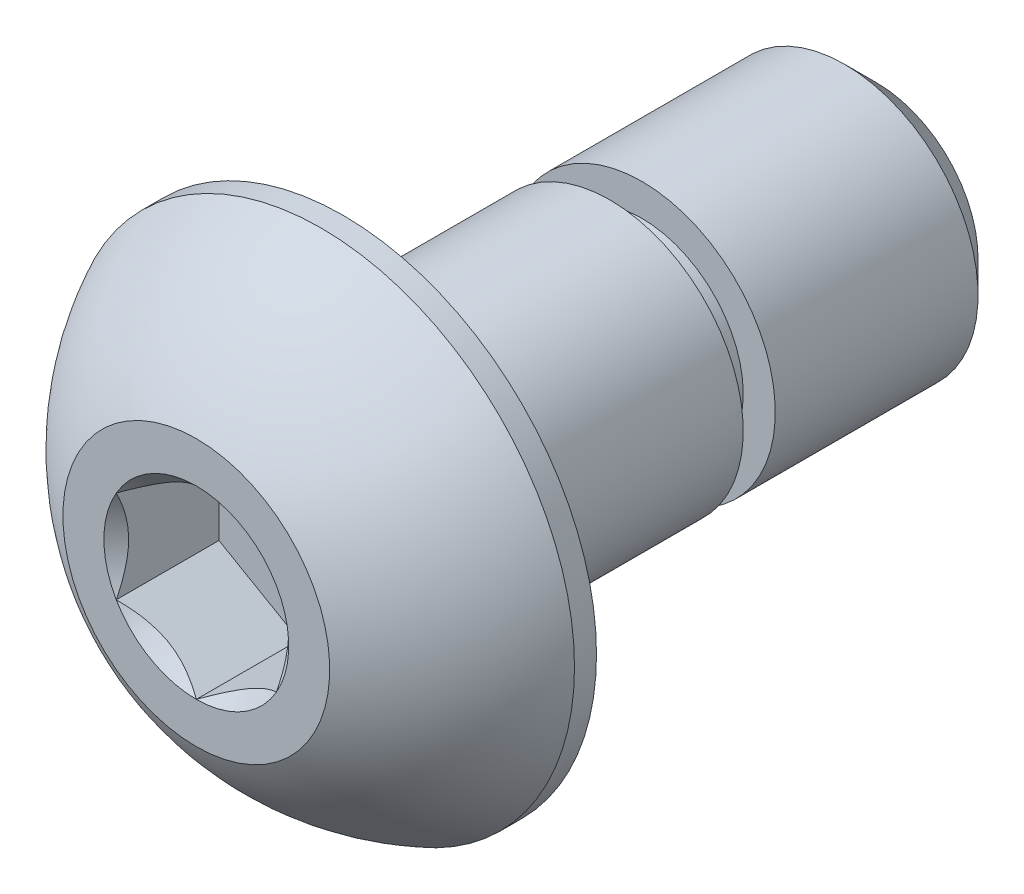
ISO-10303-21;
HEADER;
FILE_DESCRIPTION(('STEP AP214'),'2;1');
FILE_NAME('part.step','',(''),(''),'','','');
FILE_SCHEMA(('AUTOMOTIVE_DESIGN { 1 0 10303 214 1 1 1 1 }'));
ENDSEC;
DATA;
#1=APPLICATION_CONTEXT('core data for automotive mechanical design processes');
#2=APPLICATION_PROTOCOL_DEFINITION('international standard','automotive_design',2000,#1);
#3=PRODUCT_CONTEXT('',#1,'mechanical');
#4=PRODUCT('Part','Part','',(#3));
#5=PRODUCT_RELATED_PRODUCT_CATEGORY('part','',(#4));
#6=PRODUCT_DEFINITION_FORMATION('','',#4);
#7=PRODUCT_DEFINITION_CONTEXT('part definition',#1,'design');
#8=PRODUCT_DEFINITION('design','',#6,#7);
#9=PRODUCT_DEFINITION_SHAPE('','',#8);
#10=(LENGTH_UNIT() NAMED_UNIT(*) SI_UNIT(.MILLI.,.METRE.));
#11=(NAMED_UNIT(*) PLANE_ANGLE_UNIT() SI_UNIT($,.RADIAN.));
#12=(NAMED_UNIT(*) SI_UNIT($,.STERADIAN.) SOLID_ANGLE_UNIT());
#13=UNCERTAINTY_MEASURE_WITH_UNIT(LENGTH_MEASURE(1.E-05),#10,'distance_accuracy_value','');
#14=(GEOMETRIC_REPRESENTATION_CONTEXT(3) GLOBAL_UNCERTAINTY_ASSIGNED_CONTEXT((#13)) GLOBAL_UNIT_ASSIGNED_CONTEXT((#10,
#11,#12)) REPRESENTATION_CONTEXT('',''));
#15=CARTESIAN_POINT('',(0.,0.,0.));
#16=DIRECTION('',(0.,0.,1.));
#17=DIRECTION('',(1.,0.,0.));
#18=AXIS2_PLACEMENT_3D('',#15,#16,#17);
#19=CARTESIAN_POINT('',(0.,-1.73205080756888,-1.925));
#20=DIRECTION('',(0.5,-0.866025403784439,0.));
#21=DIRECTION('',(0.,0.,-1.));
#22=AXIS2_PLACEMENT_3D('',#19,#20,#21);
#23=PLANE('',#22);
#24=DIRECTION('',(0.,0.,1.));
#25=VECTOR('',#24,1.);
#26=CARTESIAN_POINT('',(0.,-1.73205080756888,-1.925));
#27=LINE('',#26,#25);
#28=CARTESIAN_POINT('',(0.,-1.73205080756888,-1.925));
#29=VERTEX_POINT('',#28);
#30=CARTESIAN_POINT('',(0.,-1.73205080756888,0.));
#31=VERTEX_POINT('',#30);
#32=EDGE_CURVE('E11',#29,#31,#27,.T.);
#33=ORIENTED_EDGE('',*,*,#32,.T.);
#34=CARTESIAN_POINT('',(0.,-1.73205080756888,0.));
#35=CARTESIAN_POINT('',(0.750000000000001,-1.29903810567666,-0.433012701892217));
#36=CARTESIAN_POINT('',(1.5,-0.866025403784438,0.));
#37=(BOUNDED_CURVE() B_SPLINE_CURVE(2,(#34,#35,#36),.UNSPECIFIED.,.F.,
.F.) B_SPLINE_CURVE_WITH_KNOTS((3,3),(-0.388312804292311,-0.130611113351457),
.UNSPECIFIED.) CURVE() GEOMETRIC_REPRESENTATION_ITEM() RATIONAL_B_SPLINE_CURVE((1.3094010767585,
1.51196612828742,1.3094010767585)) REPRESENTATION_ITEM(''));
#38=CARTESIAN_POINT('',(1.5,-0.866025403784439,0.));
#39=VERTEX_POINT('',#38);
#40=EDGE_CURVE('E142',#31,#39,#37,.T.);
#41=ORIENTED_EDGE('',*,*,#40,.T.);
#42=DIRECTION('',(0.,0.,1.));
#43=VECTOR('',#42,1.);
#44=CARTESIAN_POINT('',(1.5,-0.866025403784438,-1.925));
#45=LINE('',#44,#43);
#46=CARTESIAN_POINT('',(1.5,-0.866025403784438,-1.925));
#47=VERTEX_POINT('',#46);
#48=EDGE_CURVE('E127',#47,#39,#45,.T.);
#49=ORIENTED_EDGE('',*,*,#48,.F.);
#50=DIRECTION('',(0.866025403784439,0.5,0.));
#51=VECTOR('',#50,1.);
#52=CARTESIAN_POINT('',(0.,-1.73205080756888,-1.925));
#53=LINE('',#52,#51);
#54=EDGE_CURVE('E147',#29,#47,#53,.T.);
#55=ORIENTED_EDGE('',*,*,#54,.F.);
#56=EDGE_LOOP('',(#33,#41,#49,#55));
#57=FACE_BOUND('',#56,.T.);
#58=ADVANCED_FACE('F16',(#57),#23,.F.);
#59=CARTESIAN_POINT('',(-1.5,-0.866025403784439,-1.925));
#60=DIRECTION('',(-0.5,-0.866025403784439,0.));
#61=DIRECTION('',(-0.866025403784439,0.5,0.));
#62=AXIS2_PLACEMENT_3D('',#59,#60,#61);
#63=PLANE('',#62);
#64=DIRECTION('',(0.,0.,1.));
#65=VECTOR('',#64,1.);
#66=CARTESIAN_POINT('',(-1.5,-0.866025403784439,-1.925));
#67=LINE('',#66,#65);
#68=CARTESIAN_POINT('',(-1.5,-0.866025403784439,-1.925));
#69=VERTEX_POINT('',#68);
#70=CARTESIAN_POINT('',(-1.5,-0.86602540378444,0.));
#71=VERTEX_POINT('',#70);
#72=EDGE_CURVE('E25',#69,#71,#67,.T.);
#73=ORIENTED_EDGE('',*,*,#72,.T.);
#74=CARTESIAN_POINT('',(-1.5,-0.86602540378444,0.));
#75=CARTESIAN_POINT('',(-0.749999999999999,-1.29903810567666,-0.433012701892219));
#76=CARTESIAN_POINT('',(0.,-1.73205080756888,0.));
#77=(BOUNDED_CURVE() B_SPLINE_CURVE(2,(#74,#75,#76),.UNSPECIFIED.,.F.,
.F.) B_SPLINE_CURVE_WITH_KNOTS((3,3),(-0.388312804292311,-0.130611113351457),
.UNSPECIFIED.) CURVE() GEOMETRIC_REPRESENTATION_ITEM() RATIONAL_B_SPLINE_CURVE((1.3094010767585,
1.51196612828742,1.3094010767585)) REPRESENTATION_ITEM(''));
#78=EDGE_CURVE('E148',#71,#31,#77,.T.);
#79=ORIENTED_EDGE('',*,*,#78,.T.);
#80=ORIENTED_EDGE('',*,*,#32,.F.);
#81=DIRECTION('',(0.866025403784439,-0.5,0.));
#82=VECTOR('',#81,1.);
#83=CARTESIAN_POINT('',(-1.5,-0.866025403784439,-1.925));
#84=LINE('',#83,#82);
#85=EDGE_CURVE('E139',#69,#29,#84,.T.);
#86=ORIENTED_EDGE('',*,*,#85,.F.);
#87=EDGE_LOOP('',(#73,#79,#80,#86));
#88=FACE_BOUND('',#87,.T.);
#89=ADVANCED_FACE('F18',(#88),#63,.F.);
#90=CARTESIAN_POINT('',(-1.5,0.866025403784438,-1.925));
#91=DIRECTION('',(-1.,0.,0.));
#92=DIRECTION('',(0.,0.,1.));
#93=AXIS2_PLACEMENT_3D('',#90,#91,#92);
#94=PLANE('',#93);
#95=DIRECTION('',(0.,0.,1.));
#96=VECTOR('',#95,1.);
#97=CARTESIAN_POINT('',(-1.5,0.866025403784438,-1.925));
#98=LINE('',#97,#96);
#99=CARTESIAN_POINT('',(-1.5,0.866025403784438,-1.925));
#100=VERTEX_POINT('',#99);
#101=CARTESIAN_POINT('',(-1.5,0.866025403784438,0.));
#102=VERTEX_POINT('',#101);
#103=EDGE_CURVE('E46',#100,#102,#98,.T.);
#104=ORIENTED_EDGE('',*,*,#103,.T.);
#105=CARTESIAN_POINT('',(-1.5,0.866025403784436,0.));
#106=CARTESIAN_POINT('',(-1.5,0.,-0.433012701892219));
#107=CARTESIAN_POINT('',(-1.5,-0.86602540378444,0.));
#108=(BOUNDED_CURVE() B_SPLINE_CURVE(2,(#105,#106,#107),.UNSPECIFIED.,.F.,
.F.) B_SPLINE_CURVE_WITH_KNOTS((3,3),(-0.388312804292311,-0.130611113351457),
.UNSPECIFIED.) CURVE() GEOMETRIC_REPRESENTATION_ITEM() RATIONAL_B_SPLINE_CURVE((1.30940107675851,
1.51196612828742,1.3094010767585)) REPRESENTATION_ITEM(''));
#109=EDGE_CURVE('E229',#102,#71,#108,.T.);
#110=ORIENTED_EDGE('',*,*,#109,.T.);
#111=ORIENTED_EDGE('',*,*,#72,.F.);
#112=DIRECTION('',(0.,-1.,0.));
#113=VECTOR('',#112,1.);
#114=CARTESIAN_POINT('',(-1.5,0.866025403784438,-1.925));
#115=LINE('',#114,#113);
#116=EDGE_CURVE('E262',#100,#69,#115,.T.);
#117=ORIENTED_EDGE('',*,*,#116,.F.);
#118=EDGE_LOOP('',(#104,#110,#111,#117));
#119=FACE_BOUND('',#118,.T.);
#120=ADVANCED_FACE('F277',(#119),#94,.F.);
#121=CARTESIAN_POINT('',(0.,1.73205080756888,-1.925));
#122=DIRECTION('',(-0.5,0.866025403784439,0.));
#123=DIRECTION('',(0.,0.,1.));
#124=AXIS2_PLACEMENT_3D('',#121,#122,#123);
#125=PLANE('',#124);
#126=DIRECTION('',(0.,0.,1.));
#127=VECTOR('',#126,1.);
#128=CARTESIAN_POINT('',(0.,1.73205080756888,-1.925));
#129=LINE('',#128,#127);
#130=CARTESIAN_POINT('',(0.,1.73205080756888,-1.925));
#131=VERTEX_POINT('',#130);
#132=CARTESIAN_POINT('',(0.,1.73205080756888,0.));
#133=VERTEX_POINT('',#132);
#134=EDGE_CURVE('E188',#131,#133,#129,.T.);
#135=ORIENTED_EDGE('',*,*,#134,.T.);
#136=CARTESIAN_POINT('',(0.,1.73205080756888,0.));
#137=CARTESIAN_POINT('',(-0.749999999999999,1.29903810567666,-0.433012701892218));
#138=CARTESIAN_POINT('',(-1.5,0.866025403784438,0.));
#139=(BOUNDED_CURVE() B_SPLINE_CURVE(2,(#136,#137,#138),.UNSPECIFIED.,.F.,
.F.) B_SPLINE_CURVE_WITH_KNOTS((3,3),(-0.388312804292311,-0.130611113351457),
.UNSPECIFIED.) CURVE() GEOMETRIC_REPRESENTATION_ITEM() RATIONAL_B_SPLINE_CURVE((1.3094010767585,
1.51196612828742,1.3094010767585)) REPRESENTATION_ITEM(''));
#140=EDGE_CURVE('E221',#133,#102,#139,.T.);
#141=ORIENTED_EDGE('',*,*,#140,.T.);
#142=ORIENTED_EDGE('',*,*,#103,.F.);
#143=DIRECTION('',(-0.866025403784439,-0.5,0.));
#144=VECTOR('',#143,1.);
#145=CARTESIAN_POINT('',(0.,1.73205080756888,-1.925));
#146=LINE('',#145,#144);
#147=EDGE_CURVE('E258',#131,#100,#146,.T.);
#148=ORIENTED_EDGE('',*,*,#147,.F.);
#149=EDGE_LOOP('',(#135,#141,#142,#148));
#150=FACE_BOUND('',#149,.T.);
#151=ADVANCED_FACE('F306',(#150),#125,.F.);
#152=CARTESIAN_POINT('',(1.5,0.866025403784439,-1.925));
#153=DIRECTION('',(0.5,0.866025403784439,0.));
#154=DIRECTION('',(0.,0.,-1.));
#155=AXIS2_PLACEMENT_3D('',#152,#153,#154);
#156=PLANE('',#155);
#157=DIRECTION('',(0.,0.,1.));
#158=VECTOR('',#157,1.);
#159=CARTESIAN_POINT('',(1.5,0.866025403784439,-1.925));
#160=LINE('',#159,#158);
#161=CARTESIAN_POINT('',(1.5,0.866025403784439,-1.925));
#162=VERTEX_POINT('',#161);
#163=CARTESIAN_POINT('',(1.5,0.866025403784439,0.));
#164=VERTEX_POINT('',#163);
#165=EDGE_CURVE('E138',#162,#164,#160,.T.);
#166=ORIENTED_EDGE('',*,*,#165,.T.);
#167=CARTESIAN_POINT('',(1.5,0.86602540378444,0.));
#168=CARTESIAN_POINT('',(0.749999999999999,1.29903810567666,-0.433012701892218));
#169=CARTESIAN_POINT('',(0.,1.73205080756888,0.));
#170=(BOUNDED_CURVE() B_SPLINE_CURVE(2,(#167,#168,#169),.UNSPECIFIED.,.F.,
.F.) B_SPLINE_CURVE_WITH_KNOTS((3,3),(-0.388312804292311,-0.130611113351457),
.UNSPECIFIED.) CURVE() GEOMETRIC_REPRESENTATION_ITEM() RATIONAL_B_SPLINE_CURVE((1.3094010767585,
1.51196612828742,1.3094010767585)) REPRESENTATION_ITEM(''));
#171=EDGE_CURVE('E215',#164,#133,#170,.T.);
#172=ORIENTED_EDGE('',*,*,#171,.T.);
#173=ORIENTED_EDGE('',*,*,#134,.F.);
#174=DIRECTION('',(-0.866025403784439,0.5,0.));
#175=VECTOR('',#174,1.);
#176=CARTESIAN_POINT('',(1.5,0.866025403784439,-1.925));
#177=LINE('',#176,#175);
#178=EDGE_CURVE('E254',#162,#131,#177,.T.);
#179=ORIENTED_EDGE('',*,*,#178,.F.);
#180=EDGE_LOOP('',(#166,#172,#173,#179));
#181=FACE_BOUND('',#180,.T.);
#182=ADVANCED_FACE('F303',(#181),#156,.F.);
#183=CARTESIAN_POINT('',(1.5,-0.866025403784438,-1.925));
#184=DIRECTION('',(1.,0.,0.));
#185=DIRECTION('',(0.,1.,0.));
#186=AXIS2_PLACEMENT_3D('',#183,#184,#185);
#187=PLANE('',#186);
#188=ORIENTED_EDGE('',*,*,#48,.T.);
#189=CARTESIAN_POINT('',(1.5,-0.866025403784441,0.));
#190=CARTESIAN_POINT('',(1.5,0.,-0.433012701892218));
#191=CARTESIAN_POINT('',(1.5,0.866025403784438,0.));
#192=(BOUNDED_CURVE() B_SPLINE_CURVE(2,(#189,#190,#191),.UNSPECIFIED.,.F.,
.F.) B_SPLINE_CURVE_WITH_KNOTS((3,3),(-0.388312804292311,-0.130611113351457),
.UNSPECIFIED.) CURVE() GEOMETRIC_REPRESENTATION_ITEM() RATIONAL_B_SPLINE_CURVE((1.3094010767585,
1.51196612828742,1.3094010767585)) REPRESENTATION_ITEM(''));
#193=EDGE_CURVE('E131',#39,#164,#192,.T.);
#194=ORIENTED_EDGE('',*,*,#193,.T.);
#195=ORIENTED_EDGE('',*,*,#165,.F.);
#196=DIRECTION('',(0.,1.,0.));
#197=VECTOR('',#196,1.);
#198=CARTESIAN_POINT('',(1.5,-0.866025403784438,-1.925));
#199=LINE('',#198,#197);
#200=EDGE_CURVE('E133',#47,#162,#199,.T.);
#201=ORIENTED_EDGE('',*,*,#200,.F.);
#202=EDGE_LOOP('',(#188,#194,#195,#201));
#203=FACE_BOUND('',#202,.T.);
#204=ADVANCED_FACE('F129',(#203),#187,.F.);
#205=CARTESIAN_POINT('',(1.5,-0.866025403784438,-1.925));
#206=DIRECTION('',(0.,0.,1.));
#207=DIRECTION('',(1.,0.,0.));
#208=AXIS2_PLACEMENT_3D('',#205,#206,#207);
#209=PLANE('',#208);
#210=ORIENTED_EDGE('',*,*,#54,.T.);
#211=ORIENTED_EDGE('',*,*,#200,.T.);
#212=ORIENTED_EDGE('',*,*,#178,.T.);
#213=ORIENTED_EDGE('',*,*,#147,.T.);
#214=ORIENTED_EDGE('',*,*,#116,.T.);
#215=ORIENTED_EDGE('',*,*,#85,.T.);
#216=EDGE_LOOP('',(#210,#211,#212,#213,#214,#215));
#217=FACE_BOUND('',#216,.T.);
#218=ADVANCED_FACE('F388',(#217),#209,.T.);
#219=CARTESIAN_POINT('',(0.,0.,0.));
#220=DIRECTION('',(0.,0.,1.));
#221=DIRECTION('',(1.,0.,0.));
#222=AXIS2_PLACEMENT_3D('',#219,#220,#221);
#223=CONICAL_SURFACE('',#222,1.73205080756888,0.78539816339745);
#224=CARTESIAN_POINT('',(0.,0.,0.));
#225=DIRECTION('',(0.,0.,1.));
#226=DIRECTION('',(1.,0.,0.));
#227=AXIS2_PLACEMENT_3D('',#224,#225,#226);
#228=CIRCLE('',#227,1.73205080756888);
#229=EDGE_CURVE('E151',#31,#39,#228,.T.);
#230=ORIENTED_EDGE('',*,*,#229,.T.);
#231=ORIENTED_EDGE('',*,*,#40,.F.);
#232=EDGE_LOOP('',(#230,#231));
#233=FACE_BOUND('',#232,.T.);
#234=ADVANCED_FACE('F153',(#233),#223,.F.);
#235=CARTESIAN_POINT('',(0.,0.,0.));
#236=DIRECTION('',(0.,0.,1.));
#237=DIRECTION('',(1.,0.,0.));
#238=AXIS2_PLACEMENT_3D('',#235,#236,#237);
#239=CONICAL_SURFACE('',#238,1.73205080756888,0.78539816339745);
#240=CARTESIAN_POINT('',(0.,0.,0.));
#241=DIRECTION('',(0.,0.,1.));
#242=DIRECTION('',(1.,0.,0.));
#243=AXIS2_PLACEMENT_3D('',#240,#241,#242);
#244=CIRCLE('',#243,1.73205080756888);
#245=EDGE_CURVE('E157',#71,#31,#244,.T.);
#246=ORIENTED_EDGE('',*,*,#245,.T.);
#247=ORIENTED_EDGE('',*,*,#78,.F.);
#248=EDGE_LOOP('',(#246,#247));
#249=FACE_BOUND('',#248,.T.);
#250=ADVANCED_FACE('F275',(#249),#239,.F.);
#251=CARTESIAN_POINT('',(0.,0.,0.));
#252=DIRECTION('',(0.,0.,1.));
#253=DIRECTION('',(-1.,0.,0.));
#254=AXIS2_PLACEMENT_3D('',#251,#252,#253);
#255=CONICAL_SURFACE('',#254,1.73205080756888,0.78539816339745);
#256=CARTESIAN_POINT('',(0.,0.,0.));
#257=DIRECTION('',(0.,0.,1.));
#258=DIRECTION('',(1.,0.,0.));
#259=AXIS2_PLACEMENT_3D('',#256,#257,#258);
#260=CIRCLE('',#259,1.73205080756888);
#261=EDGE_CURVE('E198',#102,#71,#260,.T.);
#262=ORIENTED_EDGE('',*,*,#261,.T.);
#263=ORIENTED_EDGE('',*,*,#109,.F.);
#264=EDGE_LOOP('',(#262,#263));
#265=FACE_BOUND('',#264,.T.);
#266=ADVANCED_FACE('F279',(#265),#255,.F.);
#267=CARTESIAN_POINT('',(0.,0.,0.));
#268=DIRECTION('',(0.,0.,1.));
#269=DIRECTION('',(1.,0.,0.));
#270=AXIS2_PLACEMENT_3D('',#267,#268,#269);
#271=CONICAL_SURFACE('',#270,1.73205080756888,0.78539816339745);
#272=CARTESIAN_POINT('',(0.,0.,0.));
#273=DIRECTION('',(0.,0.,1.));
#274=DIRECTION('',(1.,0.,0.));
#275=AXIS2_PLACEMENT_3D('',#272,#273,#274);
#276=CIRCLE('',#275,1.73205080756888);
#277=EDGE_CURVE('E202',#133,#102,#276,.T.);
#278=ORIENTED_EDGE('',*,*,#277,.T.);
#279=ORIENTED_EDGE('',*,*,#140,.F.);
#280=EDGE_LOOP('',(#278,#279));
#281=FACE_BOUND('',#280,.T.);
#282=ADVANCED_FACE('F281',(#281),#271,.F.);
#283=CARTESIAN_POINT('',(0.,0.,0.));
#284=DIRECTION('',(0.,0.,1.));
#285=DIRECTION('',(1.,0.,0.));
#286=AXIS2_PLACEMENT_3D('',#283,#284,#285);
#287=CONICAL_SURFACE('',#286,1.73205080756888,0.78539816339745);
#288=CARTESIAN_POINT('',(0.,0.,0.));
#289=DIRECTION('',(0.,0.,1.));
#290=DIRECTION('',(1.,0.,0.));
#291=AXIS2_PLACEMENT_3D('',#288,#289,#290);
#292=CIRCLE('',#291,1.73205080756888);
#293=EDGE_CURVE('E158',#164,#133,#292,.T.);
#294=ORIENTED_EDGE('',*,*,#293,.T.);
#295=ORIENTED_EDGE('',*,*,#171,.F.);
#296=EDGE_LOOP('',(#294,#295));
#297=FACE_BOUND('',#296,.T.);
#298=ADVANCED_FACE('F288',(#297),#287,.F.);
#299=CARTESIAN_POINT('',(0.,-4.75,-2.75));
#300=DIRECTION('',(0.,0.,1.));
#301=DIRECTION('',(1.,0.,0.));
#302=AXIS2_PLACEMENT_3D('',#299,#300,#301);
#303=PLANE('',#302);
#304=CARTESIAN_POINT('',(0.,0.,-2.75));
#305=DIRECTION('',(0.,0.,-1.));
#306=DIRECTION('',(0.,-1.,0.));
#307=AXIS2_PLACEMENT_3D('',#304,#305,#306);
#308=CIRCLE('',#307,2.5);
#309=CARTESIAN_POINT('',(0.,2.5,-2.75));
#310=VERTEX_POINT('',#309);
#311=EDGE_CURVE('E179',#310,#310,#308,.T.);
#312=ORIENTED_EDGE('',*,*,#311,.F.);
#313=EDGE_LOOP('',(#312));
#314=FACE_BOUND('',#313,.T.);
#315=CARTESIAN_POINT('',(0.,0.,-2.75));
#316=DIRECTION('',(0.,0.,1.));
#317=DIRECTION('',(1.,0.,0.));
#318=AXIS2_PLACEMENT_3D('',#315,#316,#317);
#319=CIRCLE('',#318,4.75);
#320=CARTESIAN_POINT('',(-4.75,0.,-2.75));
#321=VERTEX_POINT('',#320);
#322=EDGE_CURVE('E194',#321,#321,#319,.T.);
#323=ORIENTED_EDGE('',*,*,#322,.F.);
#324=EDGE_LOOP('',(#323));
#325=FACE_BOUND('',#324,.T.);
#326=ADVANCED_FACE('F381',(#314,#325),#303,.F.);
#327=CARTESIAN_POINT('',(0.,-2.5,0.));
#328=DIRECTION('',(0.,0.,-1.));
#329=DIRECTION('',(0.,-1.,0.));
#330=AXIS2_PLACEMENT_3D('',#327,#328,#329);
#331=PLANE('',#330);
#332=ORIENTED_EDGE('',*,*,#261,.F.);
#333=ORIENTED_EDGE('',*,*,#277,.F.);
#334=ORIENTED_EDGE('',*,*,#293,.F.);
#335=CARTESIAN_POINT('',(0.,0.,0.));
#336=DIRECTION('',(0.,0.,1.));
#337=DIRECTION('',(1.,0.,0.));
#338=AXIS2_PLACEMENT_3D('',#335,#336,#337);
#339=CIRCLE('',#338,1.73205080756888);
#340=EDGE_CURVE('E162',#39,#164,#339,.T.);
#341=ORIENTED_EDGE('',*,*,#340,.F.);
#342=ORIENTED_EDGE('',*,*,#229,.F.);
#343=ORIENTED_EDGE('',*,*,#245,.F.);
#344=EDGE_LOOP('',(#332,#333,#334,#341,#342,#343));
#345=FACE_BOUND('',#344,.T.);
#346=CARTESIAN_POINT('',(0.,0.,0.));
#347=DIRECTION('',(0.,0.,1.));
#348=DIRECTION('',(1.,0.,0.));
#349=AXIS2_PLACEMENT_3D('',#346,#347,#348);
#350=CIRCLE('',#349,2.5);
#351=CARTESIAN_POINT('',(0.,-2.5,0.));
#352=VERTEX_POINT('',#351);
#353=EDGE_CURVE('E197',#352,#352,#350,.T.);
#354=ORIENTED_EDGE('',*,*,#353,.T.);
#355=EDGE_LOOP('',(#354));
#356=FACE_BOUND('',#355,.T.);
#357=ADVANCED_FACE('F164',(#345,#356),#331,.F.);
#358=CARTESIAN_POINT('',(0.,-2.50000000000007,-12.75));
#359=DIRECTION('',(0.,0.,-1.));
#360=DIRECTION('',(-1.,0.,0.));
#361=AXIS2_PLACEMENT_3D('',#358,#359,#360);
#362=PLANE('',#361);
#363=CARTESIAN_POINT('',(0.,0.,-12.75));
#364=DIRECTION('',(0.,0.,-1.));
#365=DIRECTION('',(0.,1.,0.));
#366=AXIS2_PLACEMENT_3D('',#363,#364,#365);
#367=CIRCLE('',#366,1.9);
#368=CARTESIAN_POINT('',(0.,1.89999999999993,-12.75));
#369=VERTEX_POINT('',#368);
#370=EDGE_CURVE('E345',#369,#369,#367,.T.);
#371=ORIENTED_EDGE('',*,*,#370,.T.);
#372=EDGE_LOOP('',(#371));
#373=FACE_BOUND('',#372,.T.);
#374=ADVANCED_FACE('F363',(#373),#362,.T.);
#375=CARTESIAN_POINT('',(0.,0.,-4.65805481283422));
#376=DIRECTION('',(1.,0.,0.));
#377=DIRECTION('',(0.,-1.,0.));
#378=AXIS2_PLACEMENT_3D('',#375,#376,#377);
#379=SPHERICAL_SURFACE('',#378,5.28653711226622);
#380=CARTESIAN_POINT('',(0.,0.,-4.65805481283422));
#381=DIRECTION('',(0.,0.,1.));
#382=DIRECTION('',(1.,0.,0.));
#383=AXIS2_PLACEMENT_3D('',#380,#381,#382);
#384=SPHERICAL_SURFACE('',#383,5.28653711226622);
#385=ORIENTED_EDGE('',*,*,#353,.F.);
#386=EDGE_LOOP('',(#385));
#387=FACE_BOUND('',#386,.T.);
#388=CARTESIAN_POINT('',(0.,0.,-2.3375));
#389=DIRECTION('',(0.,0.,1.));
#390=DIRECTION('',(1.,0.,0.));
#391=AXIS2_PLACEMENT_3D('',#388,#389,#390);
#392=CIRCLE('',#391,4.75);
#393=CARTESIAN_POINT('',(-4.75,0.,-2.3375));
#394=VERTEX_POINT('',#393);
#395=EDGE_CURVE('E170',#394,#394,#392,.T.);
#396=ORIENTED_EDGE('',*,*,#395,.T.);
#397=EDGE_LOOP('',(#396));
#398=FACE_BOUND('',#397,.T.);
#399=ADVANCED_FACE('F361',(#387,#398),#384,.T.);
#400=CARTESIAN_POINT('',(0.,0.,0.));
#401=DIRECTION('',(0.,0.,1.));
#402=DIRECTION('',(1.,0.,0.));
#403=AXIS2_PLACEMENT_3D('',#400,#401,#402);
#404=CYLINDRICAL_SURFACE('',#403,4.75);
#405=ORIENTED_EDGE('',*,*,#395,.F.);
#406=DIRECTION('',(0.,0.,-1.));
#407=VECTOR('',#406,1.);
#408=CARTESIAN_POINT('',(-4.75,0.,0.));
#409=LINE('',#408,#407);
#410=EDGE_CURVE('E193',#394,#321,#409,.T.);
#411=ORIENTED_EDGE('',*,*,#410,.T.);
#412=ORIENTED_EDGE('',*,*,#322,.T.);
#413=ORIENTED_EDGE('',*,*,#410,.F.);
#414=EDGE_LOOP('',(#405,#411,#412,#413));
#415=FACE_BOUND('',#414,.T.);
#416=ADVANCED_FACE('F358',(#415),#404,.T.);
#417=CARTESIAN_POINT('',(0.,0.,0.));
#418=DIRECTION('',(0.,0.,1.));
#419=DIRECTION('',(1.,0.,0.));
#420=AXIS2_PLACEMENT_3D('',#417,#418,#419);
#421=CONICAL_SURFACE('',#420,1.73205080756888,0.78539816339745);
#422=ORIENTED_EDGE('',*,*,#193,.F.);
#423=ORIENTED_EDGE('',*,*,#340,.T.);
#424=EDGE_LOOP('',(#422,#423));
#425=FACE_BOUND('',#424,.T.);
#426=ADVANCED_FACE('F172',(#425),#421,.F.);
#427=CARTESIAN_POINT('',(0.,0.,-32.75));
#428=DIRECTION('',(0.,0.,1.));
#429=DIRECTION('',(0.,-1.,0.));
#430=AXIS2_PLACEMENT_3D('',#427,#428,#429);
#431=CYLINDRICAL_SURFACE('',#430,2.5);
#432=ORIENTED_EDGE('',*,*,#311,.T.);
#433=DIRECTION('',(0.,0.,-1.));
#434=VECTOR('',#433,1.);
#435=CARTESIAN_POINT('',(0.,2.5,-32.75));
#436=LINE('',#435,#434);
#437=CARTESIAN_POINT('',(0.,2.5,-7.75000119315711));
#438=VERTEX_POINT('',#437);
#439=EDGE_CURVE('E174',#310,#438,#436,.T.);
#440=ORIENTED_EDGE('',*,*,#439,.T.);
#441=CARTESIAN_POINT('',(0.,0.,-7.75000095367417));
#442=DIRECTION('',(0.,9.57931734256394E-08,1.));
#443=DIRECTION('',(0.,-1.,9.57931734256394E-08));
#444=AXIS2_PLACEMENT_3D('',#441,#442,#443);
#445=CIRCLE('',#444,2.5);
#446=EDGE_CURVE('E325',#438,#438,#445,.T.);
#447=ORIENTED_EDGE('',*,*,#446,.T.);
#448=ORIENTED_EDGE('',*,*,#439,.F.);
#449=EDGE_LOOP('',(#432,#440,#447,#448));
#450=FACE_BOUND('',#449,.T.);
#451=ADVANCED_FACE('F376',(#450),#431,.T.);
#452=CARTESIAN_POINT('',(0.,0.,-12.75));
#453=DIRECTION('',(0.,0.,1.));
#454=DIRECTION('',(0.,-1.,0.));
#455=AXIS2_PLACEMENT_3D('',#452,#453,#454);
#456=CONICAL_SURFACE('',#455,1.9,0.785398163397445);
#457=CARTESIAN_POINT('',(0.,0.,-12.15));
#458=DIRECTION('',(0.,0.,-1.));
#459=DIRECTION('',(0.,-1.,0.));
#460=AXIS2_PLACEMENT_3D('',#457,#458,#459);
#461=CIRCLE('',#460,2.5);
#462=CARTESIAN_POINT('',(0.,2.49999999999993,-12.15));
#463=VERTEX_POINT('',#462);
#464=EDGE_CURVE('E346',#463,#463,#461,.T.);
#465=ORIENTED_EDGE('',*,*,#464,.T.);
#466=DIRECTION('',(0.,-0.707106781186545,-0.70710678118655));
#467=VECTOR('',#466,1.);
#468=CARTESIAN_POINT('',(0.,1.89999999999993,-12.75));
#469=LINE('',#468,#467);
#470=EDGE_CURVE('E350',#463,#369,#469,.T.);
#471=ORIENTED_EDGE('',*,*,#470,.T.);
#472=ORIENTED_EDGE('',*,*,#370,.F.);
#473=ORIENTED_EDGE('',*,*,#470,.F.);
#474=EDGE_LOOP('',(#465,#471,#472,#473));
#475=FACE_BOUND('',#474,.T.);
#476=ADVANCED_FACE('F378',(#475),#456,.T.);
#477=CARTESIAN_POINT('',(0.,0.,-32.75));
#478=DIRECTION('',(0.,0.,1.));
#479=DIRECTION('',(0.,-1.,0.));
#480=AXIS2_PLACEMENT_3D('',#477,#478,#479);
#481=CYLINDRICAL_SURFACE('',#480,2.5);
#482=CARTESIAN_POINT('',(0.,0.,-8.35000000000016));
#483=DIRECTION('',(0.,-9.57931760069079E-08,-1.));
#484=DIRECTION('',(0.,-1.,9.5793176006908E-08));
#485=AXIS2_PLACEMENT_3D('',#482,#483,#484);
#486=CIRCLE('',#485,2.5);
#487=CARTESIAN_POINT('',(0.,2.5,-8.3500002394831));
#488=VERTEX_POINT('',#487);
#489=EDGE_CURVE('E328',#488,#488,#486,.T.);
#490=ORIENTED_EDGE('',*,*,#489,.T.);
#491=DIRECTION('',(0.,0.,-1.));
#492=VECTOR('',#491,1.);
#493=CARTESIAN_POINT('',(0.,2.5,-32.75));
#494=LINE('',#493,#492);
#495=EDGE_CURVE('E334',#488,#463,#494,.T.);
#496=ORIENTED_EDGE('',*,*,#495,.T.);
#497=ORIENTED_EDGE('',*,*,#464,.F.);
#498=ORIENTED_EDGE('',*,*,#495,.F.);
#499=EDGE_LOOP('',(#490,#496,#497,#498));
#500=FACE_BOUND('',#499,.T.);
#501=ADVANCED_FACE('F311',(#500),#481,.T.);
#502=CARTESIAN_POINT('',(15.,1.80932104854037E-07,-8.35));
#503=DIRECTION('',(0.,-9.57931760069079E-08,-1.));
#504=DIRECTION('',(0.,-1.,9.57931760069079E-08));
#505=AXIS2_PLACEMENT_3D('',#502,#503,#504);
#506=PLANE('',#505);
#507=CARTESIAN_POINT('',(-2.48689957516035E-13,4.21489900759298E-07,-8.35000000000021));
#508=DIRECTION('',(0.,-9.57931760069079E-08,-1.));
#509=DIRECTION('',(-1.,0.,0.));
#510=AXIS2_PLACEMENT_3D('',#507,#508,#509);
#511=CIRCLE('',#510,1.9);
#512=CARTESIAN_POINT('',(1.89999999999976,4.21489900759298E-07,-8.35000000000019));
#513=VERTEX_POINT('',#512);
#514=EDGE_CURVE('E606',#513,#513,#511,.T.);
#515=ORIENTED_EDGE('',*,*,#514,.T.);
#516=EDGE_LOOP('',(#515));
#517=FACE_BOUND('',#516,.T.);
#518=ORIENTED_EDGE('',*,*,#489,.F.);
#519=EDGE_LOOP('',(#518));
#520=FACE_BOUND('',#519,.T.);
#521=ADVANCED_FACE('F308',(#517,#520),#506,.F.);
#522=CARTESIAN_POINT('',(15.,2.38407977803945E-07,-7.75000095367403));
#523=DIRECTION('',(0.,-9.57931734256393E-08,-1.));
#524=DIRECTION('',(0.,-1.,9.57931734256393E-08));
#525=AXIS2_PLACEMENT_3D('',#522,#523,#524);
#526=PLANE('',#525);
#527=CARTESIAN_POINT('',(-2.48689957516035E-13,4.78965702654932E-07,-7.75000095367422));
#528=DIRECTION('',(0.,-9.57931734256393E-08,-1.));
#529=DIRECTION('',(-1.,0.,0.));
#530=AXIS2_PLACEMENT_3D('',#527,#528,#529);
#531=CIRCLE('',#530,1.9);
#532=CARTESIAN_POINT('',(1.89999999999975,4.78965702654932E-07,-7.7500009536742));
#533=VERTEX_POINT('',#532);
#534=EDGE_CURVE('E321',#533,#533,#531,.T.);
#535=ORIENTED_EDGE('',*,*,#534,.F.);
#536=EDGE_LOOP('',(#535));
#537=FACE_BOUND('',#536,.T.);
#538=ORIENTED_EDGE('',*,*,#446,.F.);
#539=EDGE_LOOP('',(#538));
#540=FACE_BOUND('',#539,.T.);
#541=ADVANCED_FACE('F310',(#537,#540),#526,.T.);
#542=CARTESIAN_POINT('',(-2.48689957516035E-13,4.78965702654932E-07,-7.75000095367422));
#543=DIRECTION('',(0.,-9.57931730231835E-08,-1.));
#544=DIRECTION('',(-1.,0.,0.));
#545=AXIS2_PLACEMENT_3D('',#542,#543,#544);
#546=CYLINDRICAL_SURFACE('',#545,1.9);
#547=ORIENTED_EDGE('',*,*,#514,.F.);
#548=DIRECTION('',(0.,9.57931730231835E-08,1.));
#549=VECTOR('',#548,1.);
#550=CARTESIAN_POINT('',(1.89999999999976,4.78965697494769E-07,-7.7500009536742));
#551=LINE('',#550,#549);
#552=EDGE_CURVE('E337',#513,#533,#551,.T.);
#553=ORIENTED_EDGE('',*,*,#552,.T.);
#554=ORIENTED_EDGE('',*,*,#534,.T.);
#555=ORIENTED_EDGE('',*,*,#552,.F.);
#556=EDGE_LOOP('',(#547,#553,#554,#555));
#557=FACE_BOUND('',#556,.T.);
#558=ADVANCED_FACE('F301',(#557),#546,.T.);
#559=CLOSED_SHELL('',(#58,#89,#120,#151,#182,#204,#218,#234,#250,#266,#282,#298,#326,#357,#374,
#399,#416,#426,#451,#476,#501,#521,#541,#558));
#560=MANIFOLD_SOLID_BREP('B1',#559);
#561=ADVANCED_BREP_SHAPE_REPRESENTATION('',(#18,#560),#14);
#562=SHAPE_DEFINITION_REPRESENTATION(#9,#561);
ENDSEC;
END-ISO-10303-21;
